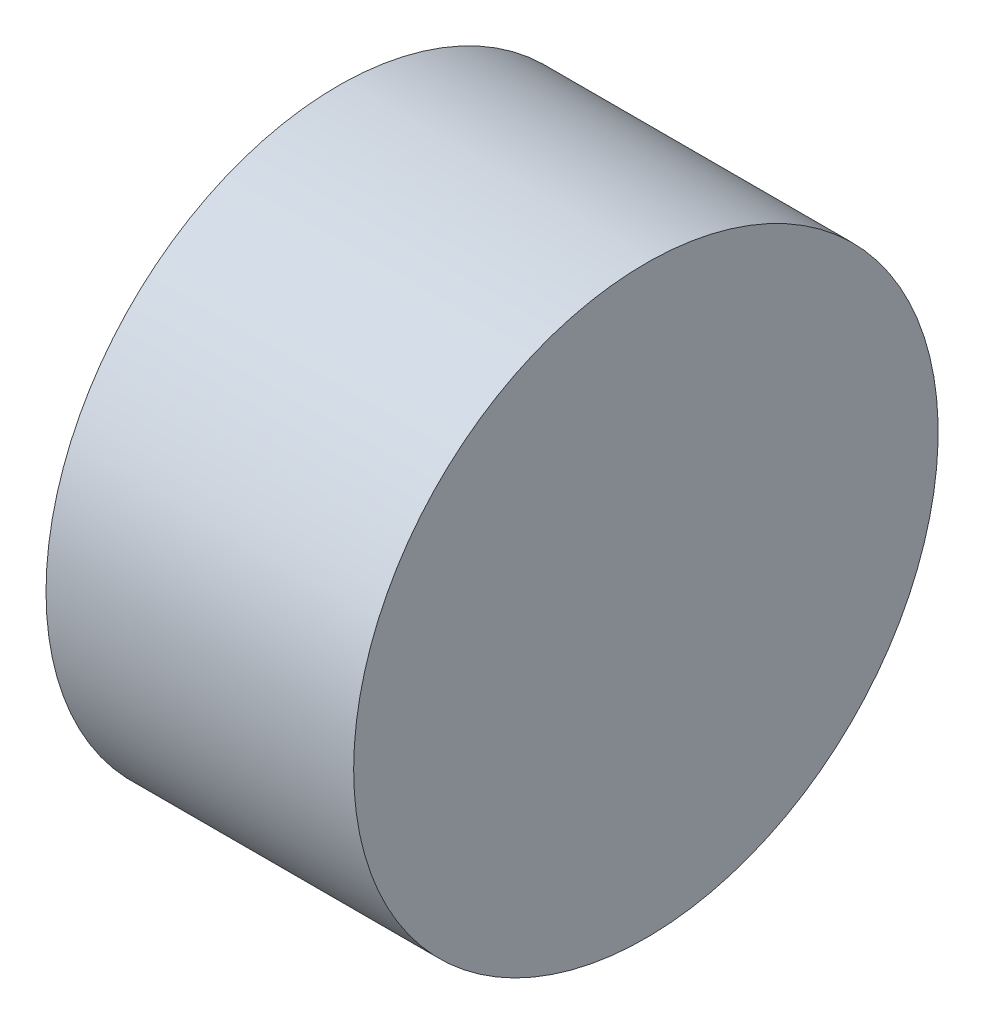
ISO-10303-21;
HEADER;
FILE_DESCRIPTION(('STEP AP214'),'2;1');
FILE_NAME('part.step','',(''),(''),'','','');
FILE_SCHEMA(('AUTOMOTIVE_DESIGN { 1 0 10303 214 1 1 1 1 }'));
ENDSEC;
DATA;
#1=APPLICATION_CONTEXT('core data for automotive mechanical design processes');
#2=APPLICATION_PROTOCOL_DEFINITION('international standard','automotive_design',2000,#1);
#3=PRODUCT_CONTEXT('',#1,'mechanical');
#4=PRODUCT('Part','Part','',(#3));
#5=PRODUCT_RELATED_PRODUCT_CATEGORY('part','',(#4));
#6=PRODUCT_DEFINITION_FORMATION('','',#4);
#7=PRODUCT_DEFINITION_CONTEXT('part definition',#1,'design');
#8=PRODUCT_DEFINITION('design','',#6,#7);
#9=PRODUCT_DEFINITION_SHAPE('','',#8);
#10=(LENGTH_UNIT() NAMED_UNIT(*) SI_UNIT(.MILLI.,.METRE.));
#11=(NAMED_UNIT(*) PLANE_ANGLE_UNIT() SI_UNIT($,.RADIAN.));
#12=(NAMED_UNIT(*) SI_UNIT($,.STERADIAN.) SOLID_ANGLE_UNIT());
#13=UNCERTAINTY_MEASURE_WITH_UNIT(LENGTH_MEASURE(1.E-05),#10,'distance_accuracy_value','');
#14=(GEOMETRIC_REPRESENTATION_CONTEXT(3) GLOBAL_UNCERTAINTY_ASSIGNED_CONTEXT((#13)) GLOBAL_UNIT_ASSIGNED_CONTEXT((#10,
#11,#12)) REPRESENTATION_CONTEXT('',''));
#15=CARTESIAN_POINT('',(0.,0.,0.));
#16=DIRECTION('',(0.,0.,1.));
#17=DIRECTION('',(1.,0.,0.));
#18=AXIS2_PLACEMENT_3D('',#15,#16,#17);
#19=CARTESIAN_POINT('',(0.,0.,0.));
#20=DIRECTION('',(-1.,0.,0.));
#21=DIRECTION('',(0.,0.,1.));
#22=AXIS2_PLACEMENT_3D('',#19,#20,#21);
#23=PLANE('',#22);
#24=CARTESIAN_POINT('',(0.,0.,0.));
#25=DIRECTION('',(-1.,0.,0.));
#26=DIRECTION('',(0.,0.,1.));
#27=AXIS2_PLACEMENT_3D('',#24,#25,#26);
#28=CIRCLE('',#27,4.74999999999998);
#29=CARTESIAN_POINT('',(0.,0.,4.74999999999998));
#30=VERTEX_POINT('',#29);
#31=EDGE_CURVE('E10',#30,#30,#28,.T.);
#32=ORIENTED_EDGE('',*,*,#31,.F.);
#33=EDGE_LOOP('',(#32));
#34=FACE_BOUND('',#33,.T.);
#35=ADVANCED_FACE('F31',(#34),#23,.F.);
#36=CARTESIAN_POINT('',(-124.153021442495,0.,0.));
#37=DIRECTION('',(-1.,0.,0.));
#38=DIRECTION('',(0.,0.,1.));
#39=AXIS2_PLACEMENT_3D('',#36,#37,#38);
#40=CYLINDRICAL_SURFACE('',#39,4.74999999999998);
#41=CARTESIAN_POINT('',(-5.00000000000001,0.,0.));
#42=DIRECTION('',(-1.,0.,0.));
#43=DIRECTION('',(0.,0.,1.));
#44=AXIS2_PLACEMENT_3D('',#41,#42,#43);
#45=CIRCLE('',#44,4.74999999999998);
#46=CARTESIAN_POINT('',(-5.00000000000002,0.,4.74999999999999));
#47=VERTEX_POINT('',#46);
#48=EDGE_CURVE('E37',#47,#47,#45,.T.);
#49=ORIENTED_EDGE('',*,*,#48,.F.);
#50=EDGE_LOOP('',(#49));
#51=FACE_BOUND('',#50,.T.);
#52=ORIENTED_EDGE('',*,*,#31,.T.);
#53=EDGE_LOOP('',(#52));
#54=FACE_BOUND('',#53,.T.);
#55=ADVANCED_FACE('F61',(#51,#54),#40,.T.);
#56=CARTESIAN_POINT('',(-5.00000000000001,4.74999999999999,0.));
#57=DIRECTION('',(1.,0.,0.));
#58=DIRECTION('',(0.,0.,-1.));
#59=AXIS2_PLACEMENT_3D('',#56,#57,#58);
#60=PLANE('',#59);
#61=CARTESIAN_POINT('',(-5.00000000000001,0.,0.));
#62=DIRECTION('',(-1.,0.,0.));
#63=DIRECTION('',(0.,0.,1.));
#64=AXIS2_PLACEMENT_3D('',#61,#62,#63);
#65=CIRCLE('',#64,3.99999999999998);
#66=CARTESIAN_POINT('',(-5.00000000000002,0.,3.99999999999999));
#67=VERTEX_POINT('',#66);
#68=EDGE_CURVE('E41',#67,#67,#65,.T.);
#69=ORIENTED_EDGE('',*,*,#68,.F.);
#70=EDGE_LOOP('',(#69));
#71=FACE_BOUND('',#70,.T.);
#72=ORIENTED_EDGE('',*,*,#48,.T.);
#73=EDGE_LOOP('',(#72));
#74=FACE_BOUND('',#73,.T.);
#75=ADVANCED_FACE('F56',(#71,#74),#60,.F.);
#76=CARTESIAN_POINT('',(-124.153021442495,0.,0.));
#77=DIRECTION('',(-1.,0.,0.));
#78=DIRECTION('',(0.,0.,1.));
#79=AXIS2_PLACEMENT_3D('',#76,#77,#78);
#80=CYLINDRICAL_SURFACE('',#79,3.99999999999998);
#81=CARTESIAN_POINT('',(-0.750000000000008,0.,0.));
#82=DIRECTION('',(-1.,0.,0.));
#83=DIRECTION('',(0.,0.,1.));
#84=AXIS2_PLACEMENT_3D('',#81,#82,#83);
#85=CIRCLE('',#84,3.99999999999998);
#86=CARTESIAN_POINT('',(-0.750000000000012,0.,3.99999999999998));
#87=VERTEX_POINT('',#86);
#88=EDGE_CURVE('E45',#87,#87,#85,.T.);
#89=ORIENTED_EDGE('',*,*,#88,.F.);
#90=EDGE_LOOP('',(#89));
#91=FACE_BOUND('',#90,.T.);
#92=ORIENTED_EDGE('',*,*,#68,.T.);
#93=EDGE_LOOP('',(#92));
#94=FACE_BOUND('',#93,.T.);
#95=ADVANCED_FACE('F53',(#91,#94),#80,.F.);
#96=CARTESIAN_POINT('',(-0.750000000000001,4.,0.));
#97=DIRECTION('',(1.,0.,0.));
#98=DIRECTION('',(0.,0.,-1.));
#99=AXIS2_PLACEMENT_3D('',#96,#97,#98);
#100=PLANE('',#99);
#101=ORIENTED_EDGE('',*,*,#88,.T.);
#102=EDGE_LOOP('',(#101));
#103=FACE_BOUND('',#102,.T.);
#104=ADVANCED_FACE('F51',(#103),#100,.F.);
#105=CLOSED_SHELL('',(#35,#55,#75,#95,#104));
#106=MANIFOLD_SOLID_BREP('B2',#105);
#107=ADVANCED_BREP_SHAPE_REPRESENTATION('',(#18,#106),#14);
#108=SHAPE_DEFINITION_REPRESENTATION(#9,#107);
ENDSEC;
END-ISO-10303-21;
